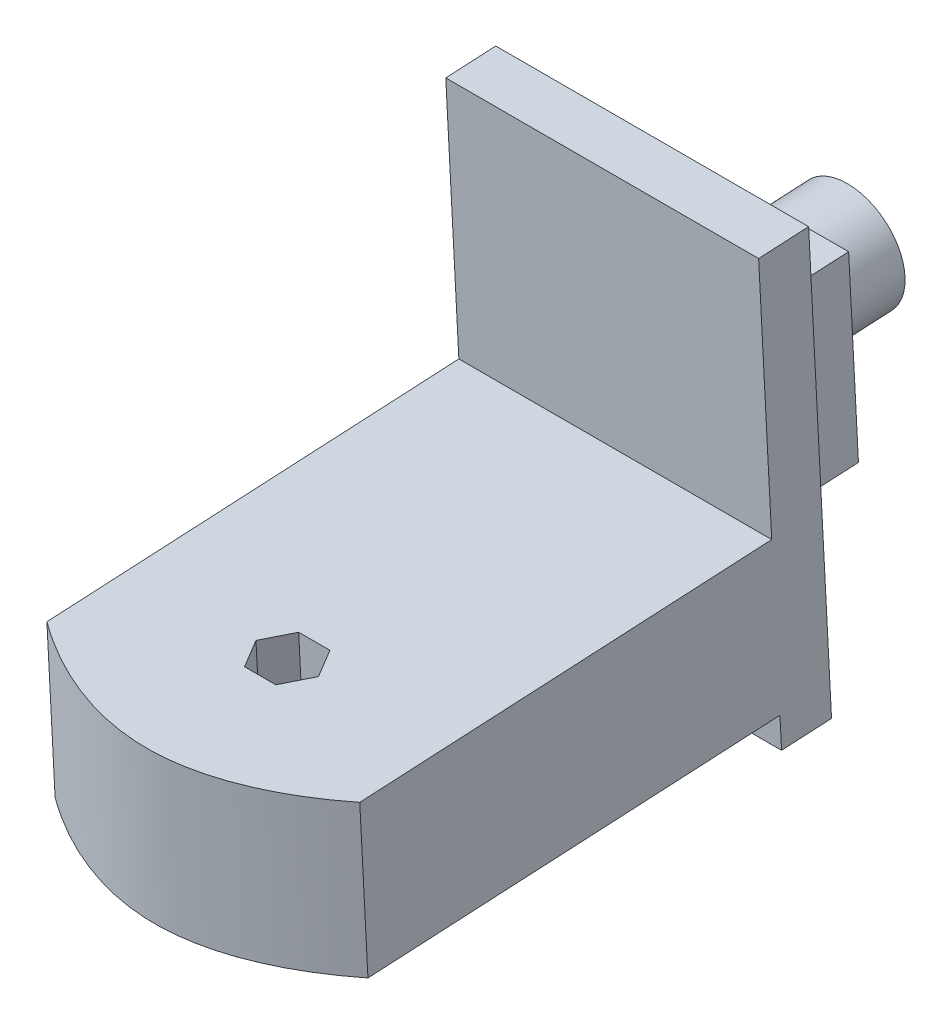
ISO-10303-21;
HEADER;
FILE_DESCRIPTION(('STEP AP214'),'2;1');
FILE_NAME('part.step','',(''),(''),'','','');
FILE_SCHEMA(('AUTOMOTIVE_DESIGN { 1 0 10303 214 1 1 1 1 }'));
ENDSEC;
DATA;
#1=APPLICATION_CONTEXT('core data for automotive mechanical design processes');
#2=APPLICATION_PROTOCOL_DEFINITION('international standard','automotive_design',2000,#1);
#3=PRODUCT_CONTEXT('',#1,'mechanical');
#4=PRODUCT('Part','Part','',(#3));
#5=PRODUCT_RELATED_PRODUCT_CATEGORY('part','',(#4));
#6=PRODUCT_DEFINITION_FORMATION('','',#4);
#7=PRODUCT_DEFINITION_CONTEXT('part definition',#1,'design');
#8=PRODUCT_DEFINITION('design','',#6,#7);
#9=PRODUCT_DEFINITION_SHAPE('','',#8);
#10=(LENGTH_UNIT() NAMED_UNIT(*) SI_UNIT(.MILLI.,.METRE.));
#11=(NAMED_UNIT(*) PLANE_ANGLE_UNIT() SI_UNIT($,.RADIAN.));
#12=(NAMED_UNIT(*) SI_UNIT($,.STERADIAN.) SOLID_ANGLE_UNIT());
#13=UNCERTAINTY_MEASURE_WITH_UNIT(LENGTH_MEASURE(1.E-05),#10,'distance_accuracy_value','');
#14=(GEOMETRIC_REPRESENTATION_CONTEXT(3) GLOBAL_UNCERTAINTY_ASSIGNED_CONTEXT((#13)) GLOBAL_UNIT_ASSIGNED_CONTEXT((#10,
#11,#12)) REPRESENTATION_CONTEXT('',''));
#15=CARTESIAN_POINT('',(0.,0.,0.));
#16=DIRECTION('',(0.,0.,1.));
#17=DIRECTION('',(1.,0.,0.));
#18=AXIS2_PLACEMENT_3D('',#15,#16,#17);
#19=CARTESIAN_POINT('',(170.943026116261,-96.0443024505512,-27.8509531780287));
#20=DIRECTION('',(-2.35658714764497E-13,0.0523359562420088,-0.998629534754623));
#21=DIRECTION('',(0.,0.998629534754623,0.0523359562420088));
#22=AXIS2_PLACEMENT_3D('',#19,#20,#21);
#23=PLANE('',#22);
#24=DIRECTION('',(-1.,0.,2.35355942975305E-13));
#25=VECTOR('',#24,1.);
#26=CARTESIAN_POINT('',(-5.36812434298047E-12,-14.6244424314603,-23.5839191249282));
#27=LINE('',#26,#25);
#28=CARTESIAN_POINT('',(369.809169947691,-14.6244424314557,-23.5839191250153));
#29=VERTEX_POINT('',#28);
#30=CARTESIAN_POINT('',(359.809169947688,-14.6244424314558,-23.5839191250129));
#31=VERTEX_POINT('',#30);
#32=EDGE_CURVE('E220',#29,#31,#27,.T.);
#33=ORIENTED_EDGE('',*,*,#32,.T.);
#34=DIRECTION('',(0.,-0.998629534754623,-0.0523359562420088));
#35=VECTOR('',#34,1.);
#36=CARTESIAN_POINT('',(359.809169947689,1.19253829905249,-22.7549862899792));
#37=LINE('',#36,#35);
#38=CARTESIAN_POINT('',(359.809169947689,-22.6134787094928,-24.002606774949));
#39=VERTEX_POINT('',#38);
#40=EDGE_CURVE('E226',#31,#39,#37,.T.);
#41=ORIENTED_EDGE('',*,*,#40,.T.);
#42=DIRECTION('',(1.,0.,-2.35335752686142E-13));
#43=VECTOR('',#42,1.);
#44=CARTESIAN_POINT('',(170.943026116261,-22.6134787094951,-24.0026067749045));
#45=LINE('',#44,#43);
#46=CARTESIAN_POINT('',(369.80916994769,-22.6134787094927,-24.0026067749513));
#47=VERTEX_POINT('',#46);
#48=EDGE_CURVE('E275',#47,#39,#45,.F.);
#49=ORIENTED_EDGE('',*,*,#48,.F.);
#50=DIRECTION('',(0.,-0.998629534754623,-0.0523359562420088));
#51=VECTOR('',#50,1.);
#52=CARTESIAN_POINT('',(369.80916994769,1.19253829905262,-22.7549862899815));
#53=LINE('',#52,#51);
#54=EDGE_CURVE('E239',#29,#47,#53,.T.);
#55=ORIENTED_EDGE('',*,*,#54,.F.);
#56=EDGE_LOOP('',(#33,#41,#49,#55));
#57=FACE_BOUND('',#56,.T.);
#58=ADVANCED_FACE('F53',(#57),#23,.F.);
#59=DIRECTION('',(1.,0.,-2.35335752686142E-13));
#60=VECTOR('',#59,1.);
#61=CARTESIAN_POINT('',(170.943026116261,-27.6066263832683,-24.2642865561146));
#62=LINE('',#61,#60);
#63=CARTESIAN_POINT('',(359.809169947689,-27.6066263832659,-24.264286556159));
#64=VERTEX_POINT('',#63);
#65=CARTESIAN_POINT('',(369.80916994769,-27.6066263832658,-24.2642865561614));
#66=VERTEX_POINT('',#65);
#67=EDGE_CURVE('E430',#64,#66,#62,.T.);
#68=ORIENTED_EDGE('',*,*,#67,.F.);
#69=CARTESIAN_POINT('',(359.809169947688,-28.6052559180206,-24.316622512401));
#70=VERTEX_POINT('',#69);
#71=EDGE_CURVE('E185',#64,#70,#37,.T.);
#72=ORIENTED_EDGE('',*,*,#71,.T.);
#73=DIRECTION('',(-1.,0.,2.35354992675635E-13));
#74=VECTOR('',#73,1.);
#75=CARTESIAN_POINT('',(-5.36556898368748E-12,-28.6052559180251,-24.3166225123164));
#76=LINE('',#75,#74);
#77=CARTESIAN_POINT('',(369.80916994769,-28.6052559180204,-24.3166225124034));
#78=VERTEX_POINT('',#77);
#79=EDGE_CURVE('E231',#78,#70,#76,.T.);
#80=ORIENTED_EDGE('',*,*,#79,.F.);
#81=EDGE_CURVE('E243',#66,#78,#53,.T.);
#82=ORIENTED_EDGE('',*,*,#81,.F.);
#83=EDGE_LOOP('',(#68,#72,#80,#82));
#84=FACE_BOUND('',#83,.T.);
#85=ADVANCED_FACE('F55',(#84),#23,.F.);
#86=CARTESIAN_POINT('',(369.80916994769,-26.3944066573955,-9.18017162245737));
#87=DIRECTION('',(1.,0.,0.));
#88=DIRECTION('',(0.,0.,-1.));
#89=AXIS2_PLACEMENT_3D('',#86,#87,#88);
#90=PLANE('',#89);
#91=DIRECTION('',(0.,-0.998629534754574,-0.0523359562429485));
#92=VECTOR('',#91,1.);
#93=CARTESIAN_POINT('',(369.80916994769,-23.3035608042251,-10.8350559996082));
#94=LINE('',#93,#92);
#95=CARTESIAN_POINT('',(369.80916994769,-23.3035608042251,-10.8350559996082));
#96=VERTEX_POINT('',#95);
#97=CARTESIAN_POINT('',(369.80916994769,-28.296708477998,-11.0967357808229));
#98=VERTEX_POINT('',#97);
#99=EDGE_CURVE('E324',#96,#98,#94,.T.);
#100=ORIENTED_EDGE('',*,*,#99,.T.);
#101=DIRECTION('',(0.,0.0523359562429438,-0.998629534754574));
#102=VECTOR('',#101,1.);
#103=CARTESIAN_POINT('',(369.80916994769,-28.3916657269047,-9.28484353494327));
#104=LINE('',#103,#102);
#105=EDGE_CURVE('E325',#66,#98,#104,.F.);
#106=ORIENTED_EDGE('',*,*,#105,.F.);
#107=ORIENTED_EDGE('',*,*,#81,.T.);
#108=DIRECTION('',(2.35658714764497E-13,-0.0523359562420088,0.998629534754623));
#109=VECTOR('',#108,1.);
#110=CARTESIAN_POINT('',(369.809169947688,-28.3396541651841,-29.3846058628639));
#111=LINE('',#110,#109);
#112=CARTESIAN_POINT('',(369.809169947689,-28.5215183880332,-25.9144297680107));
#113=VERTEX_POINT('',#112);
#114=EDGE_CURVE('E233',#113,#78,#111,.T.);
#115=ORIENTED_EDGE('',*,*,#114,.F.);
#116=DIRECTION('',(0.,0.998629534754623,0.0523359562420088));
#117=VECTOR('',#116,1.);
#118=CARTESIAN_POINT('',(369.809169947689,-95.9605649205602,-29.4487604336828));
#119=LINE('',#118,#117);
#120=CARTESIAN_POINT('',(369.809169947691,-14.5407049014684,-25.1817263806226));
#121=VERTEX_POINT('',#120);
#122=EDGE_CURVE('E237',#113,#121,#119,.T.);
#123=ORIENTED_EDGE('',*,*,#122,.T.);
#124=DIRECTION('',(2.35658714764497E-13,-0.0523359562420088,0.998629534754623));
#125=VECTOR('',#124,1.);
#126=CARTESIAN_POINT('',(369.80916994769,-14.3588406786194,-28.6519024754758));
#127=LINE('',#126,#125);
#128=EDGE_CURVE('E230',#121,#29,#127,.T.);
#129=ORIENTED_EDGE('',*,*,#128,.T.);
#130=ORIENTED_EDGE('',*,*,#54,.T.);
#131=DIRECTION('',(0.,0.0523359562429438,-0.998629534754574));
#132=VECTOR('',#131,1.);
#133=CARTESIAN_POINT('',(369.80916994769,-23.3985180531318,-9.02316375372855));
#134=LINE('',#133,#132);
#135=EDGE_CURVE('E281',#47,#96,#134,.F.);
#136=ORIENTED_EDGE('',*,*,#135,.T.);
#137=EDGE_LOOP('',(#100,#106,#107,#115,#123,#129,#130,#136));
#138=FACE_BOUND('',#137,.T.);
#139=ADVANCED_FACE('F421',(#138),#90,.T.);
#140=CARTESIAN_POINT('',(369.80916994769,-18.3179028519629,-10.5737687380653));
#141=CARTESIAN_POINT('',(368.37085052264,-18.3725343942236,-9.53133681272721));
#142=CARTESIAN_POINT('',(366.628871560234,-18.4126554324053,-8.76578179912894));
#143=CARTESIAN_POINT('',(363.019201443494,-18.4130630903801,-8.75800322158937));
#144=CARTESIAN_POINT('',(361.259076626337,-18.3729745117132,-9.52293887074917));
#145=CARTESIAN_POINT('',(359.809169947689,-18.3179028519629,-10.5737687380653));
#146=CARTESIAN_POINT('',(369.80916994769,-19.5836657872643,-10.6401045626032));
#147=CARTESIAN_POINT('',(368.37085052264,-19.638297329525,-9.59767263726513));
#148=CARTESIAN_POINT('',(366.628871560234,-19.6784183677067,-8.83211762366687));
#149=CARTESIAN_POINT('',(363.019201443494,-19.6788260256816,-8.8243390461273));
#150=CARTESIAN_POINT('',(361.259076626337,-19.6387374470147,-9.58927469528711));
#151=CARTESIAN_POINT('',(359.809169947689,-19.5836657872643,-10.6401045626032));
#152=CARTESIAN_POINT('',(369.80916994769,-20.55732958365,-10.6911321199401));
#153=CARTESIAN_POINT('',(368.37085052264,-20.6119611259108,-9.64870019460201));
#154=CARTESIAN_POINT('',(366.628871560234,-20.6520821640924,-8.88314518100374));
#155=CARTESIAN_POINT('',(363.019201443494,-20.6524898220672,-8.87536660346417));
#156=CARTESIAN_POINT('',(361.259076626337,-20.6124012434004,-9.64030225262397));
#157=CARTESIAN_POINT('',(359.809169947689,-20.55732958365,-10.6911321199401));
#158=CARTESIAN_POINT('',(369.80916994769,-21.306301734716,-10.7303840871223));
#159=CARTESIAN_POINT('',(368.37085052264,-21.3609332769766,-9.68795216178423));
#160=CARTESIAN_POINT('',(366.628871560234,-21.4010543151584,-8.92239714818595));
#161=CARTESIAN_POINT('',(363.019201443494,-21.4014619731332,-8.91461857064637));
#162=CARTESIAN_POINT('',(361.259076626337,-21.3613733944663,-9.67955421980619));
#163=CARTESIAN_POINT('',(359.809169947689,-21.306301734716,-10.7303840871223));
#164=CARTESIAN_POINT('',(369.80916994769,-26.2994494084888,-10.992063868337));
#165=CARTESIAN_POINT('',(368.37085052264,-26.3540809507496,-9.94963194299893));
#166=CARTESIAN_POINT('',(366.628871560234,-26.3942019889312,-9.18407692940067));
#167=CARTESIAN_POINT('',(363.019201443494,-26.394609646906,-9.17629835186109));
#168=CARTESIAN_POINT('',(361.259076626337,-26.3545210682391,-9.94123400102091));
#169=CARTESIAN_POINT('',(359.809169947689,-26.2994494084888,-10.992063868337));
#170=CARTESIAN_POINT('',(369.80916994769,-27.2980789432434,-11.0443998245799));
#171=CARTESIAN_POINT('',(368.37085052264,-27.3527104855041,-10.0019678992419));
#172=CARTESIAN_POINT('',(366.628871560234,-27.3928315236858,-9.23641288564361));
#173=CARTESIAN_POINT('',(363.019201443494,-27.3932391816606,-9.22863430810403));
#174=CARTESIAN_POINT('',(361.259076626337,-27.3531506029937,-9.99356995726385));
#175=CARTESIAN_POINT('',(359.809169947689,-27.2980789432434,-11.0443998245799));
#176=CARTESIAN_POINT('',(369.80916994769,-28.0220853559405,-11.0823433928561));
#177=CARTESIAN_POINT('',(368.37085052264,-28.0767168982012,-10.039911467518));
#178=CARTESIAN_POINT('',(366.628871560234,-28.1168379363829,-9.27435645391975));
#179=CARTESIAN_POINT('',(363.019201443494,-28.1172455943577,-9.26657787638017));
#180=CARTESIAN_POINT('',(361.259076626337,-28.0771570156908,-10.03151352554));
#181=CARTESIAN_POINT('',(359.809169947689,-28.0220853559405,-11.0823433928561));
#182=CARTESIAN_POINT('',(369.80916994769,-28.2967084779979,-11.0967357808229));
#183=CARTESIAN_POINT('',(368.37085052264,-28.3513400202587,-10.0543038554848));
#184=CARTESIAN_POINT('',(366.628871560234,-28.3914610584403,-9.28874884188655));
#185=CARTESIAN_POINT('',(363.019201443494,-28.3918687164152,-9.28097026434697));
#186=CARTESIAN_POINT('',(361.259076626337,-28.3517801377483,-10.0459059135068));
#187=CARTESIAN_POINT('',(359.809169947689,-28.2967084779979,-11.0967357808229));
#188=CARTESIAN_POINT('',(369.80916994769,-29.2878482912419,-11.148679217394));
#189=CARTESIAN_POINT('',(368.37085052264,-29.3424798335026,-10.1062472920559));
#190=CARTESIAN_POINT('',(366.628871560234,-29.3826008716842,-9.34069227845767));
#191=CARTESIAN_POINT('',(363.019201443494,-29.3830085296591,-9.33291370091809));
#192=CARTESIAN_POINT('',(361.259076626337,-29.3429199509922,-10.0978493500779));
#193=CARTESIAN_POINT('',(359.809169947689,-29.2878482912419,-11.148679217394));
#194=B_SPLINE_SURFACE_WITH_KNOTS('',1,3,((#140,#141,#142,#143,#144,#145),(#146,#147,#148,#149,
#150,#151),(#152,#153,#154,#155,#156,#157),(#158,#159,#160,#161,#162,#163),(#164,#165,#166,#167,
#168,#169),(#170,#171,#172,#173,#174,#175),(#176,#177,#178,#179,#180,#181),(#182,#183,#184,#185,
#186,#187),(#188,#189,#190,#191,#192,#193)),.UNSPECIFIED.,.F.,.F.,.F.,(2,1,1,1,1,1,1,1,2),(4,2,
4),(-0.5985,-0.345,-0.15,0.,1.,1.2,1.345,1.4,1.5985),(0.,0.00535800247808712,
0.0107160049561742),.UNSPECIFIED.);
#195=CARTESIAN_POINT('',(369.80916994769,-23.3035608042251,-10.8350559996082));
#196=CARTESIAN_POINT('',(369.646763180283,-23.309727978548,-10.7173793033761));
#197=CARTESIAN_POINT('',(369.481339566826,-23.3156806743701,-10.6037951007333));
#198=CARTESIAN_POINT('',(369.144058278917,-23.3271329038055,-10.3852735454972));
#199=CARTESIAN_POINT('',(368.972180433007,-23.3326308084866,-10.2803672747815));
#200=CARTESIAN_POINT('',(368.622499520392,-23.3431125227902,-10.0803642514331));
#201=CARTESIAN_POINT('',(368.444689571786,-23.3480957057507,-9.98527945622294));
#202=CARTESIAN_POINT('',(368.081454844204,-23.3575396683834,-9.80507791435565));
#203=CARTESIAN_POINT('',(367.895965319617,-23.3619936551765,-9.72009078354988));
#204=CARTESIAN_POINT('',(367.519900970822,-23.3702399093267,-9.56274288094822));
#205=CARTESIAN_POINT('',(367.32933170034,-23.3740328677293,-9.49036892321715));
#206=CARTESIAN_POINT('',(366.943547961573,-23.3808857743893,-9.35960767452947));
#207=CARTESIAN_POINT('',(366.748337053214,-23.3839462656723,-9.30121002202756));
#208=CARTESIAN_POINT('',(366.424552069651,-23.3883060878852,-9.21801965844856));
#209=CARTESIAN_POINT('',(366.297137435068,-23.3898436904919,-9.18868045293912));
#210=CARTESIAN_POINT('',(366.040925053869,-23.3925635136076,-9.13678313630305));
#211=CARTESIAN_POINT('',(365.912127374152,-23.3937457512266,-9.11422469869591));
#212=CARTESIAN_POINT('',(365.653486408947,-23.3957335024187,-9.0762961464982));
#213=CARTESIAN_POINT('',(365.523643252223,-23.3965390616833,-9.06092516006202));
#214=CARTESIAN_POINT('',(365.264152309548,-23.3977508250917,-9.03780333683281));
#215=CARTESIAN_POINT('',(365.134509081763,-23.3981596784156,-9.03000195067444));
#216=CARTESIAN_POINT('',(364.874973528932,-23.3985683630251,-9.02220378377817));
#217=CARTESIAN_POINT('',(364.745081190864,-23.3985681723107,-9.02220742282585));
#218=CARTESIAN_POINT('',(364.485554127226,-23.3981563785426,-9.03006491600111));
#219=CARTESIAN_POINT('',(364.355919386245,-23.3977448008905,-9.03791828543818));
#220=CARTESIAN_POINT('',(364.033098571467,-23.3962292759288,-9.0668362243872));
#221=CARTESIAN_POINT('',(363.840315910256,-23.3948830255922,-9.09252421107623));
#222=CARTESIAN_POINT('',(363.457471699658,-23.3913819649661,-9.15932842743316));
#223=CARTESIAN_POINT('',(363.26741057093,-23.3892270310521,-9.20044701600064));
#224=CARTESIAN_POINT('',(362.889720298335,-23.3841654547606,-9.29702764507382));
#225=CARTESIAN_POINT('',(362.702114142896,-23.3812541436457,-9.35257877039789));
#226=CARTESIAN_POINT('',(362.331251064509,-23.374758094915,-9.4765307641582));
#227=CARTESIAN_POINT('',(362.147993865988,-23.3711734000973,-9.54493081595932));
#228=CARTESIAN_POINT('',(361.774454714102,-23.3631421579375,-9.69817604538165));
#229=CARTESIAN_POINT('',(361.584495577115,-23.3586546145801,-9.7838034735765));
#230=CARTESIAN_POINT('',(361.210364396561,-23.3490586828724,-9.96690475813629));
#231=CARTESIAN_POINT('',(361.026193636234,-23.3439501580603,-10.0643812183486));
#232=CARTESIAN_POINT('',(360.666263451868,-23.3332416210558,-10.2687122766587));
#233=CARTESIAN_POINT('',(360.490426804504,-23.3276486920834,-10.3754317188651));
#234=CARTESIAN_POINT('',(360.145054346671,-23.315966345655,-10.5983441678988));
#235=CARTESIAN_POINT('',(359.975514095746,-23.3098772881534,-10.7145303063862));
#236=CARTESIAN_POINT('',(359.809169947689,-23.3035608042251,-10.8350559996082));
#237=B_SPLINE_CURVE_WITH_KNOTS('',3,(#195,#196,#197,#198,#199,#200,#201,#202,#203,#204,#205,
#206,#207,#208,#209,#210,#211,#212,#213,#214,#215,#216,#217,#218,#219,#220,#221,#222,#223,#224,
#225,#226,#227,#228,#229,#230,#231,#232,#233,#234,#235,#236),.UNSPECIFIED.,.F.,.F.,(4,2,2,2,2,2,
2,2,2,2,2,2,2,2,2,2,2,2,2,2,4),(0.,0.601948124640674,1.2059664785925,1.81071175182481,
2.42253123166662,3.03370722186758,3.64442869411318,4.0365418118416,4.4286360470769,
4.82068270851116,5.21009290789558,5.59952405132412,5.98893115037018,6.57167945753763,
7.15451688663984,7.7410410770076,8.3275280024482,8.95231625889374,9.57724206280081,
10.1942138335945,10.810741894198),.UNSPECIFIED.);
#238=CARTESIAN_POINT('',(359.809169947689,-23.3035608042251,-10.8350559996082));
#239=VERTEX_POINT('',#238);
#240=EDGE_CURVE('E274',#96,#239,#237,.T.);
#241=DIRECTION('',(0.,0.998629534754574,0.0523359562429485));
#242=VECTOR('',#241,1.);
#243=CARTESIAN_POINT('',(359.809169947689,-28.2967084779979,-11.0967357808229));
#244=LINE('',#243,#242);
#245=CARTESIAN_POINT('',(359.809169947689,-28.296708477998,-11.0967357808229));
#246=VERTEX_POINT('',#245);
#247=EDGE_CURVE('E270',#246,#239,#244,.T.);
#248=CARTESIAN_POINT('',(369.80916994769,-28.2967084779979,-11.0967357808229));
#249=CARTESIAN_POINT('',(369.646763180283,-28.3028756523209,-10.9790590845908));
#250=CARTESIAN_POINT('',(369.481339566826,-28.308828348143,-10.865474881948));
#251=CARTESIAN_POINT('',(369.144058278917,-28.3202805775784,-10.6469533267119));
#252=CARTESIAN_POINT('',(368.972180433007,-28.3257784822595,-10.5420470559963));
#253=CARTESIAN_POINT('',(368.622499520392,-28.3362601965631,-10.3420440326479));
#254=CARTESIAN_POINT('',(368.444689571786,-28.3412433795236,-10.2469592374377));
#255=CARTESIAN_POINT('',(368.081454844204,-28.3506873421563,-10.0667576955704));
#256=CARTESIAN_POINT('',(367.895965319617,-28.3551413289494,-9.98177056476466));
#257=CARTESIAN_POINT('',(367.519900970823,-28.3633875830996,-9.82442266216302));
#258=CARTESIAN_POINT('',(367.32933170034,-28.3671805415022,-9.75204870443193));
#259=CARTESIAN_POINT('',(366.943547961573,-28.3740334481622,-9.62128745574422));
#260=CARTESIAN_POINT('',(366.748337053214,-28.3770939394452,-9.56288980324229));
#261=CARTESIAN_POINT('',(366.424552069651,-28.3814537616581,-9.47969943966329));
#262=CARTESIAN_POINT('',(366.297137435068,-28.3829913642648,-9.45036023415386));
#263=CARTESIAN_POINT('',(366.040925053869,-28.3857111873805,-9.39846291751778));
#264=CARTESIAN_POINT('',(365.912127374152,-28.3868934249995,-9.37590447991064));
#265=CARTESIAN_POINT('',(365.653486408948,-28.3888811761916,-9.33797592771292));
#266=CARTESIAN_POINT('',(365.523643252223,-28.3896867354562,-9.32260494127673));
#267=CARTESIAN_POINT('',(365.264152309548,-28.3908984988646,-9.29948311804752));
#268=CARTESIAN_POINT('',(365.134509081763,-28.3913073521885,-9.29168173188915));
#269=CARTESIAN_POINT('',(364.874973528932,-28.391716036798,-9.28388356499288));
#270=CARTESIAN_POINT('',(364.745081190864,-28.3917158460836,-9.28388720404057));
#271=CARTESIAN_POINT('',(364.485554127226,-28.3913040523155,-9.29174469721583));
#272=CARTESIAN_POINT('',(364.355919386245,-28.3908924746634,-9.29959806665289));
#273=CARTESIAN_POINT('',(364.033098571467,-28.3893769497016,-9.32851600560191));
#274=CARTESIAN_POINT('',(363.840315910256,-28.388030699365,-9.35420399229096));
#275=CARTESIAN_POINT('',(363.457471699658,-28.384529638739,-9.42100820864789));
#276=CARTESIAN_POINT('',(363.26741057093,-28.382374704825,-9.46212679721535));
#277=CARTESIAN_POINT('',(362.889720298335,-28.3773131285335,-9.55870742628855));
#278=CARTESIAN_POINT('',(362.702114142896,-28.3744018174186,-9.61425855161266));
#279=CARTESIAN_POINT('',(362.331251064509,-28.3679057686879,-9.73821054537299));
#280=CARTESIAN_POINT('',(362.147993865988,-28.3643210738701,-9.80661059717406));
#281=CARTESIAN_POINT('',(361.774454714102,-28.3562898317104,-9.95985582659642));
#282=CARTESIAN_POINT('',(361.584495577115,-28.351802288353,-10.0454832547913));
#283=CARTESIAN_POINT('',(361.210364396561,-28.3422063566453,-10.2285845393511));
#284=CARTESIAN_POINT('',(361.026193636234,-28.3370978318332,-10.3260609995633));
#285=CARTESIAN_POINT('',(360.666263451868,-28.3263892948287,-10.5303920578735));
#286=CARTESIAN_POINT('',(360.490426804504,-28.3207963658563,-10.6371115000798));
#287=CARTESIAN_POINT('',(360.145054346671,-28.3091140194279,-10.8600239491136));
#288=CARTESIAN_POINT('',(359.975514095746,-28.3030249619263,-10.976210087601));
#289=CARTESIAN_POINT('',(359.809169947689,-28.2967084779979,-11.0967357808229));
#290=B_SPLINE_CURVE_WITH_KNOTS('',3,(#248,#249,#250,#251,#252,#253,#254,#255,#256,#257,#258,
#259,#260,#261,#262,#263,#264,#265,#266,#267,#268,#269,#270,#271,#272,#273,#274,#275,#276,#277,
#278,#279,#280,#281,#282,#283,#284,#285,#286,#287,#288,#289),.UNSPECIFIED.,.F.,.F.,(4,2,2,2,2,2,
2,2,2,2,2,2,2,2,2,2,2,2,2,2,4),(0.,0.601948124640672,1.20596647859242,1.81071175182478,
2.4225312316665,3.03370722186742,3.64442869411309,4.03654181184151,4.42863604707686,
4.82068270851117,5.21009290789566,5.59952405132414,5.98893115037025,6.57167945753776,
7.15451688663997,7.74104107700775,8.32752800244833,8.95231625889386,9.57724206280093,
10.1942138335945,10.810741894198),.UNSPECIFIED.);
#291=EDGE_CURVE('E316',#98,#246,#290,.T.);
#292=ORIENTED_EDGE('',*,*,#99,.F.);
#293=ORIENTED_EDGE('',*,*,#240,.T.);
#294=ORIENTED_EDGE('',*,*,#247,.F.);
#295=ORIENTED_EDGE('',*,*,#291,.F.);
#296=EDGE_LOOP('',(#292,#293,#294,#295));
#297=FACE_BOUND('',#296,.T.);
#298=ADVANCED_FACE('F296',(#297),#194,.F.);
#299=CARTESIAN_POINT('',(359.809169947689,-28.3916657269047,-9.28484353494327));
#300=DIRECTION('',(0.,-0.998629534754574,-0.0523359562429438));
#301=DIRECTION('',(0.,0.0523359562429438,-0.998629534754574));
#302=AXIS2_PLACEMENT_3D('',#299,#300,#301);
#303=PLANE('',#302);
#304=DIRECTION('',(1.,0.,0.));
#305=VECTOR('',#304,1.);
#306=CARTESIAN_POINT('',(364.309169947689,-28.1108296561737,-14.6435149874058));
#307=LINE('',#306,#305);
#308=CARTESIAN_POINT('',(364.309169947689,-28.1108296561737,-14.6435149874058));
#309=VERTEX_POINT('',#308);
#310=CARTESIAN_POINT('',(365.30916994769,-28.1108296561737,-14.6435149874057));
#311=VERTEX_POINT('',#310);
#312=EDGE_CURVE('E354',#309,#311,#307,.T.);
#313=ORIENTED_EDGE('',*,*,#312,.F.);
#314=DIRECTION('',(0.499999999999956,0.0453242676377388,-0.864838546066921));
#315=VECTOR('',#314,1.);
#316=CARTESIAN_POINT('',(363.809169947689,-28.1561539238115,-13.7786764413389));
#317=LINE('',#316,#315);
#318=CARTESIAN_POINT('',(363.809169947689,-28.1561539238115,-13.7786764413389));
#319=VERTEX_POINT('',#318);
#320=EDGE_CURVE('E370',#319,#309,#317,.T.);
#321=ORIENTED_EDGE('',*,*,#320,.F.);
#322=DIRECTION('',(-0.500000000000007,0.0453242676377418,-0.864838546066892));
#323=VECTOR('',#322,1.);
#324=CARTESIAN_POINT('',(364.30916994769,-28.2014781914492,-12.913837895272));
#325=LINE('',#324,#323);
#326=CARTESIAN_POINT('',(364.30916994769,-28.2014781914492,-12.913837895272));
#327=VERTEX_POINT('',#326);
#328=EDGE_CURVE('E367',#327,#319,#325,.T.);
#329=ORIENTED_EDGE('',*,*,#328,.F.);
#330=DIRECTION('',(-1.,0.,0.));
#331=VECTOR('',#330,1.);
#332=CARTESIAN_POINT('',(365.30916994769,-28.2014781914492,-12.913837895272));
#333=LINE('',#332,#331);
#334=CARTESIAN_POINT('',(365.30916994769,-28.2014781914492,-12.913837895272));
#335=VERTEX_POINT('',#334);
#336=EDGE_CURVE('E364',#335,#327,#333,.T.);
#337=ORIENTED_EDGE('',*,*,#336,.F.);
#338=DIRECTION('',(-0.50000000000001,-0.0453242676377421,0.86483854606689));
#339=VECTOR('',#338,1.);
#340=CARTESIAN_POINT('',(365.80916994769,-28.1561539238115,-13.7786764413388));
#341=LINE('',#340,#339);
#342=CARTESIAN_POINT('',(365.80916994769,-28.1561539238115,-13.7786764413388));
#343=VERTEX_POINT('',#342);
#344=EDGE_CURVE('E361',#343,#335,#341,.T.);
#345=ORIENTED_EDGE('',*,*,#344,.F.);
#346=DIRECTION('',(0.500000000000008,-0.0453242676377384,0.864838546066891));
#347=VECTOR('',#346,1.);
#348=CARTESIAN_POINT('',(365.30916994769,-28.1108296561737,-14.6435149874057));
#349=LINE('',#348,#347);
#350=EDGE_CURVE('E356',#311,#343,#349,.T.);
#351=ORIENTED_EDGE('',*,*,#350,.F.);
#352=EDGE_LOOP('',(#313,#321,#329,#337,#345,#351));
#353=FACE_BOUND('',#352,.T.);
#354=DIRECTION('',(0.,0.0523359562429438,-0.998629534754574));
#355=VECTOR('',#354,1.);
#356=CARTESIAN_POINT('',(359.809169947689,-28.3916657269047,-9.28484353494327));
#357=LINE('',#356,#355);
#358=EDGE_CURVE('E434',#246,#64,#357,.T.);
#359=ORIENTED_EDGE('',*,*,#358,.T.);
#360=ORIENTED_EDGE('',*,*,#67,.T.);
#361=ORIENTED_EDGE('',*,*,#105,.T.);
#362=ORIENTED_EDGE('',*,*,#291,.T.);
#363=EDGE_LOOP('',(#359,#360,#361,#362));
#364=FACE_BOUND('',#363,.T.);
#365=ADVANCED_FACE('F311',(#353,#364),#303,.T.);
#366=CARTESIAN_POINT('',(359.809169947689,-26.3944066573955,-9.18017162245739));
#367=DIRECTION('',(-1.,0.,0.));
#368=DIRECTION('',(0.,0.,1.));
#369=AXIS2_PLACEMENT_3D('',#366,#367,#368);
#370=PLANE('',#369);
#371=DIRECTION('',(0.,0.052335956242944,-0.998629534754574));
#372=VECTOR('',#371,1.);
#373=CARTESIAN_POINT('',(359.809169947689,-23.3035608042251,-10.8350559996082));
#374=LINE('',#373,#372);
#375=EDGE_CURVE('E268',#239,#39,#374,.T.);
#376=ORIENTED_EDGE('',*,*,#375,.T.);
#377=ORIENTED_EDGE('',*,*,#40,.F.);
#378=DIRECTION('',(2.35658714764497E-13,-0.0523359562420088,0.998629534754623));
#379=VECTOR('',#378,1.);
#380=CARTESIAN_POINT('',(359.809169947687,-14.3588406786195,-28.6519024754735));
#381=LINE('',#380,#379);
#382=CARTESIAN_POINT('',(359.809169947688,-14.5407049014685,-25.1817263806214));
#383=VERTEX_POINT('',#382);
#384=EDGE_CURVE('E228',#383,#31,#381,.T.);
#385=ORIENTED_EDGE('',*,*,#384,.F.);
#386=DIRECTION('',(0.,0.998629534754623,0.0523359562420088));
#387=VECTOR('',#386,1.);
#388=CARTESIAN_POINT('',(359.809169947689,-95.9605649205603,-29.4487604336805));
#389=LINE('',#388,#387);
#390=CARTESIAN_POINT('',(359.809169947688,-28.5215183880333,-25.9144297680096));
#391=VERTEX_POINT('',#390);
#392=EDGE_CURVE('E352',#391,#383,#389,.T.);
#393=ORIENTED_EDGE('',*,*,#392,.F.);
#394=DIRECTION('',(2.35658714764497E-13,-0.0523359562420088,0.998629534754623));
#395=VECTOR('',#394,1.);
#396=CARTESIAN_POINT('',(359.809169947687,-28.3396541651843,-29.3846058628616));
#397=LINE('',#396,#395);
#398=EDGE_CURVE('E235',#391,#70,#397,.T.);
#399=ORIENTED_EDGE('',*,*,#398,.T.);
#400=ORIENTED_EDGE('',*,*,#71,.F.);
#401=ORIENTED_EDGE('',*,*,#358,.F.);
#402=ORIENTED_EDGE('',*,*,#247,.T.);
#403=EDGE_LOOP('',(#376,#377,#385,#393,#399,#400,#401,#402));
#404=FACE_BOUND('',#403,.T.);
#405=ADVANCED_FACE('F266',(#404),#370,.T.);
#406=CARTESIAN_POINT('',(359.809169947689,-23.3985180531318,-9.02316375372855));
#407=DIRECTION('',(0.,-0.998629534754574,-0.0523359562429438));
#408=DIRECTION('',(0.,0.0523359562429438,-0.998629534754574));
#409=AXIS2_PLACEMENT_3D('',#406,#407,#408);
#410=PLANE('',#409);
#411=DIRECTION('',(0.499999999999956,0.0453242676377414,-0.864838546066921));
#412=VECTOR('',#411,1.);
#413=CARTESIAN_POINT('',(360.860612789175,-23.430288637634,-8.41694488819353));
#414=LINE('',#413,#412);
#415=CARTESIAN_POINT('',(363.809169947689,-23.1630062500386,-13.5169966601241));
#416=VERTEX_POINT('',#415);
#417=CARTESIAN_POINT('',(364.309169947689,-23.1176819824008,-14.381835206191));
#418=VERTEX_POINT('',#417);
#419=EDGE_CURVE('E343',#416,#418,#414,.T.);
#420=ORIENTED_EDGE('',*,*,#419,.T.);
#421=DIRECTION('',(1.,0.,0.));
#422=VECTOR('',#421,1.);
#423=CARTESIAN_POINT('',(359.80916994769,-23.1176819824008,-14.3818352061912));
#424=LINE('',#423,#422);
#425=CARTESIAN_POINT('',(365.30916994769,-23.1176819824008,-14.381835206191));
#426=VERTEX_POINT('',#425);
#427=EDGE_CURVE('E346',#418,#426,#424,.T.);
#428=ORIENTED_EDGE('',*,*,#427,.T.);
#429=DIRECTION('',(0.500000000000008,-0.0453242676377399,0.864838546066891));
#430=VECTOR('',#429,1.);
#431=CARTESIAN_POINT('',(366.257727106204,-23.2036672994453,-12.7411376185282));
#432=LINE('',#431,#430);
#433=CARTESIAN_POINT('',(365.80916994769,-23.1630062500386,-13.5169966601242));
#434=VERTEX_POINT('',#433);
#435=EDGE_CURVE('E331',#426,#434,#432,.T.);
#436=ORIENTED_EDGE('',*,*,#435,.T.);
#437=DIRECTION('',(-0.50000000000001,-0.0453242676377398,0.86483854606689));
#438=VECTOR('',#437,1.);
#439=CARTESIAN_POINT('',(362.360612789174,-23.4756129052717,-7.55210634212674));
#440=LINE('',#439,#438);
#441=CARTESIAN_POINT('',(365.30916994769,-23.2083305176763,-12.6521581140573));
#442=VERTEX_POINT('',#441);
#443=EDGE_CURVE('E334',#434,#442,#440,.T.);
#444=ORIENTED_EDGE('',*,*,#443,.T.);
#445=DIRECTION('',(-1.,0.,0.));
#446=VECTOR('',#445,1.);
#447=CARTESIAN_POINT('',(359.809169947689,-23.2083305176763,-12.6521581140572));
#448=LINE('',#447,#446);
#449=CARTESIAN_POINT('',(364.30916994769,-23.2083305176763,-12.6521581140573));
#450=VERTEX_POINT('',#449);
#451=EDGE_CURVE('E337',#442,#450,#448,.T.);
#452=ORIENTED_EDGE('',*,*,#451,.T.);
#453=DIRECTION('',(-0.500000000000007,0.0453242676377399,-0.864838546066892));
#454=VECTOR('',#453,1.);
#455=CARTESIAN_POINT('',(364.757727106204,-23.248991567083,-11.8762990724613));
#456=LINE('',#455,#454);
#457=EDGE_CURVE('E340',#450,#416,#456,.T.);
#458=ORIENTED_EDGE('',*,*,#457,.T.);
#459=EDGE_LOOP('',(#420,#428,#436,#444,#452,#458));
#460=FACE_BOUND('',#459,.T.);
#461=ORIENTED_EDGE('',*,*,#48,.T.);
#462=ORIENTED_EDGE('',*,*,#375,.F.);
#463=ORIENTED_EDGE('',*,*,#240,.F.);
#464=ORIENTED_EDGE('',*,*,#135,.F.);
#465=EDGE_LOOP('',(#461,#462,#463,#464));
#466=FACE_BOUND('',#465,.T.);
#467=ADVANCED_FACE('F302',(#460,#466),#410,.F.);
#468=CARTESIAN_POINT('',(364.309169947689,-8.77010257612766,-13.6299104314212));
#469=DIRECTION('',(0.,0.0523359562429438,-0.998629534754574));
#470=DIRECTION('',(0.,0.998629534754574,0.0523359562429438));
#471=AXIS2_PLACEMENT_3D('',#468,#469,#470);
#472=PLANE('',#471);
#473=DIRECTION('',(0.,-0.998629534754574,-0.0523359562429438));
#474=VECTOR('',#473,1.);
#475=CARTESIAN_POINT('',(364.309169947689,-8.77010257612766,-13.6299104314212));
#476=LINE('',#475,#474);
#477=EDGE_CURVE('E283',#418,#309,#476,.T.);
#478=ORIENTED_EDGE('',*,*,#477,.T.);
#479=ORIENTED_EDGE('',*,*,#312,.T.);
#480=DIRECTION('',(0.,-0.998629534754574,-0.0523359562429438));
#481=VECTOR('',#480,1.);
#482=CARTESIAN_POINT('',(365.30916994769,-8.77010257612766,-13.6299104314211));
#483=LINE('',#482,#481);
#484=EDGE_CURVE('E373',#426,#311,#483,.T.);
#485=ORIENTED_EDGE('',*,*,#484,.F.);
#486=ORIENTED_EDGE('',*,*,#427,.F.);
#487=EDGE_LOOP('',(#478,#479,#485,#486));
#488=FACE_BOUND('',#487,.T.);
#489=ADVANCED_FACE('F307',(#488),#472,.F.);
#490=CARTESIAN_POINT('',(363.809169947689,-8.8154268437654,-12.7650718853543));
#491=DIRECTION('',(-0.866025403784464,0.0261679781214696,-0.499314767377243));
#492=DIRECTION('',(-0.499485811384465,0.,0.866322067262287));
#493=AXIS2_PLACEMENT_3D('',#490,#491,#492);
#494=PLANE('',#493);
#495=DIRECTION('',(0.,-0.998629534754574,-0.0523359562429438));
#496=VECTOR('',#495,1.);
#497=CARTESIAN_POINT('',(363.809169947689,-8.8154268437654,-12.7650718853543));
#498=LINE('',#497,#496);
#499=EDGE_CURVE('E375',#416,#319,#498,.T.);
#500=ORIENTED_EDGE('',*,*,#499,.T.);
#501=ORIENTED_EDGE('',*,*,#320,.T.);
#502=ORIENTED_EDGE('',*,*,#477,.F.);
#503=ORIENTED_EDGE('',*,*,#419,.F.);
#504=EDGE_LOOP('',(#500,#501,#502,#503));
#505=FACE_BOUND('',#504,.T.);
#506=ADVANCED_FACE('F401',(#505),#494,.F.);
#507=CARTESIAN_POINT('',(364.30916994769,-8.86075111140314,-11.9002333392874));
#508=DIRECTION('',(-0.866025403784435,-0.0261679781214723,0.499314767377294));
#509=DIRECTION('',(0.499485811384515,0.,0.866322067262258));
#510=AXIS2_PLACEMENT_3D('',#507,#508,#509);
#511=PLANE('',#510);
#512=DIRECTION('',(0.,-0.998629534754574,-0.0523359562429438));
#513=VECTOR('',#512,1.);
#514=CARTESIAN_POINT('',(364.30916994769,-8.86075111140314,-11.9002333392874));
#515=LINE('',#514,#513);
#516=EDGE_CURVE('E377',#450,#327,#515,.T.);
#517=ORIENTED_EDGE('',*,*,#516,.T.);
#518=ORIENTED_EDGE('',*,*,#328,.T.);
#519=ORIENTED_EDGE('',*,*,#499,.F.);
#520=ORIENTED_EDGE('',*,*,#457,.F.);
#521=EDGE_LOOP('',(#517,#518,#519,#520));
#522=FACE_BOUND('',#521,.T.);
#523=ADVANCED_FACE('F404',(#522),#511,.F.);
#524=CARTESIAN_POINT('',(365.30916994769,-8.86075111140314,-11.9002333392874));
#525=DIRECTION('',(0.,-0.0523359562429438,0.998629534754574));
#526=DIRECTION('',(0.,-0.998629534754574,-0.0523359562429438));
#527=AXIS2_PLACEMENT_3D('',#524,#525,#526);
#528=PLANE('',#527);
#529=DIRECTION('',(0.,-0.998629534754574,-0.0523359562429438));
#530=VECTOR('',#529,1.);
#531=CARTESIAN_POINT('',(365.30916994769,-8.86075111140314,-11.9002333392874));
#532=LINE('',#531,#530);
#533=EDGE_CURVE('E379',#442,#335,#532,.T.);
#534=ORIENTED_EDGE('',*,*,#533,.T.);
#535=ORIENTED_EDGE('',*,*,#336,.T.);
#536=ORIENTED_EDGE('',*,*,#516,.F.);
#537=ORIENTED_EDGE('',*,*,#451,.F.);
#538=EDGE_LOOP('',(#534,#535,#536,#537));
#539=FACE_BOUND('',#538,.T.);
#540=ADVANCED_FACE('F407',(#539),#528,.F.);
#541=CARTESIAN_POINT('',(365.80916994769,-8.8154268437654,-12.7650718853543));
#542=DIRECTION('',(0.866025403784433,-0.0261679781214724,0.499314767377297));
#543=DIRECTION('',(0.499485811384518,0.,-0.866322067262256));
#544=AXIS2_PLACEMENT_3D('',#541,#542,#543);
#545=PLANE('',#544);
#546=DIRECTION('',(0.,-0.998629534754574,-0.0523359562429438));
#547=VECTOR('',#546,1.);
#548=CARTESIAN_POINT('',(365.80916994769,-8.8154268437654,-12.7650718853543));
#549=LINE('',#548,#547);
#550=EDGE_CURVE('E381',#434,#343,#549,.T.);
#551=ORIENTED_EDGE('',*,*,#550,.T.);
#552=ORIENTED_EDGE('',*,*,#344,.T.);
#553=ORIENTED_EDGE('',*,*,#533,.F.);
#554=ORIENTED_EDGE('',*,*,#443,.F.);
#555=EDGE_LOOP('',(#551,#552,#553,#554));
#556=FACE_BOUND('',#555,.T.);
#557=ADVANCED_FACE('F397',(#556),#545,.F.);
#558=CARTESIAN_POINT('',(365.30916994769,-8.77010257612766,-13.6299104314211));
#559=DIRECTION('',(0.866025403784434,0.0261679781214723,-0.499314767377295));
#560=DIRECTION('',(-0.499485811384516,0.,-0.866322067262257));
#561=AXIS2_PLACEMENT_3D('',#558,#559,#560);
#562=PLANE('',#561);
#563=ORIENTED_EDGE('',*,*,#484,.T.);
#564=ORIENTED_EDGE('',*,*,#350,.T.);
#565=ORIENTED_EDGE('',*,*,#550,.F.);
#566=ORIENTED_EDGE('',*,*,#435,.F.);
#567=EDGE_LOOP('',(#563,#564,#565,#566));
#568=FACE_BOUND('',#567,.T.);
#569=ADVANCED_FACE('F387',(#568),#562,.F.);
#570=CARTESIAN_POINT('',(-6.56152243915069E-12,-28.3396541651888,-29.3846058627769));
#571=DIRECTION('',(0.,0.998629534754623,0.0523359562420088));
#572=DIRECTION('',(0.,-0.0523359562420088,0.998629534754623));
#573=AXIS2_PLACEMENT_3D('',#570,#571,#572);
#574=PLANE('',#573);
#575=DIRECTION('',(1.,0.,-2.35327275138071E-13));
#576=VECTOR('',#575,1.);
#577=CARTESIAN_POINT('',(170.943026116261,-28.5215183880357,-25.914429767964));
#578=LINE('',#577,#576);
#579=EDGE_CURVE('E13',#391,#113,#578,.T.);
#580=ORIENTED_EDGE('',*,*,#579,.T.);
#581=ORIENTED_EDGE('',*,*,#114,.T.);
#582=ORIENTED_EDGE('',*,*,#79,.T.);
#583=ORIENTED_EDGE('',*,*,#398,.F.);
#584=EDGE_LOOP('',(#580,#581,#582,#583));
#585=FACE_BOUND('',#584,.T.);
#586=ADVANCED_FACE('F509',(#585),#574,.F.);
#587=CARTESIAN_POINT('',(-6.56407779844368E-12,-14.358840678624,-28.6519024753888));
#588=DIRECTION('',(0.,0.998629534754623,0.0523359562420088));
#589=DIRECTION('',(0.,-0.0523359562420088,0.998629534754623));
#590=AXIS2_PLACEMENT_3D('',#587,#588,#589);
#591=PLANE('',#590);
#592=ORIENTED_EDGE('',*,*,#384,.T.);
#593=ORIENTED_EDGE('',*,*,#32,.F.);
#594=ORIENTED_EDGE('',*,*,#128,.F.);
#595=DIRECTION('',(1.,0.,-2.35328225437742E-13));
#596=VECTOR('',#595,1.);
#597=CARTESIAN_POINT('',(170.943026116261,-14.5407049014709,-25.1817263805758));
#598=LINE('',#597,#596);
#599=EDGE_CURVE('E62',#383,#121,#598,.T.);
#600=ORIENTED_EDGE('',*,*,#599,.F.);
#601=EDGE_LOOP('',(#592,#593,#594,#600));
#602=FACE_BOUND('',#601,.T.);
#603=ADVANCED_FACE('F259',(#602),#591,.T.);
#604=CARTESIAN_POINT('',(170.943026116261,-95.9605649205626,-29.4487604336361));
#605=DIRECTION('',(-2.35658714764497E-13,0.0523359562420088,-0.998629534754623));
#606=DIRECTION('',(0.,0.998629534754623,0.0523359562420088));
#607=AXIS2_PLACEMENT_3D('',#604,#605,#606);
#608=PLANE('',#607);
#609=DIRECTION('',(0.,0.998629534754623,0.0523359562420087));
#610=VECTOR('',#609,1.);
#611=CARTESIAN_POINT('',(367.809169947689,1.2762758290398,-24.3527935455884));
#612=LINE('',#611,#610);
#613=CARTESIAN_POINT('',(367.809169947689,-24.0276854816374,-25.6789179649212));
#614=VERTEX_POINT('',#613);
#615=CARTESIAN_POINT('',(367.809169947689,-18.0359082731096,-25.3649022274692));
#616=VERTEX_POINT('',#615);
#617=EDGE_CURVE('E183',#614,#616,#612,.T.);
#618=ORIENTED_EDGE('',*,*,#617,.T.);
#619=DIRECTION('',(-1.,0.,2.3528085645073E-13));
#620=VECTOR('',#619,1.);
#621=CARTESIAN_POINT('',(-5.73849544884362E-12,-18.0359082731143,-25.3649022273827));
#622=LINE('',#621,#620);
#623=CARTESIAN_POINT('',(361.809169947688,-18.0359082731097,-25.3649022274678));
#624=VERTEX_POINT('',#623);
#625=EDGE_CURVE('E199',#616,#624,#622,.T.);
#626=ORIENTED_EDGE('',*,*,#625,.T.);
#627=DIRECTION('',(0.,0.998629534754623,0.0523359562420087));
#628=VECTOR('',#627,1.);
#629=CARTESIAN_POINT('',(361.809169947689,1.27627582903973,-24.352793545587));
#630=LINE('',#629,#628);
#631=CARTESIAN_POINT('',(361.809169947689,-24.0276854816374,-25.6789179649198));
#632=VERTEX_POINT('',#631);
#633=EDGE_CURVE('E74',#632,#624,#630,.T.);
#634=ORIENTED_EDGE('',*,*,#633,.F.);
#635=DIRECTION('',(-1.,0.,2.3528085645073E-13));
#636=VECTOR('',#635,1.);
#637=CARTESIAN_POINT('',(-5.73617398785454E-12,-24.027685481642,-25.6789179648347));
#638=LINE('',#637,#636);
#639=EDGE_CURVE('E69',#614,#632,#638,.T.);
#640=ORIENTED_EDGE('',*,*,#639,.F.);
#641=EDGE_LOOP('',(#618,#626,#634,#640));
#642=FACE_BOUND('',#641,.T.);
#643=ORIENTED_EDGE('',*,*,#579,.F.);
#644=ORIENTED_EDGE('',*,*,#392,.T.);
#645=ORIENTED_EDGE('',*,*,#599,.T.);
#646=ORIENTED_EDGE('',*,*,#122,.F.);
#647=EDGE_LOOP('',(#643,#644,#645,#646));
#648=FACE_BOUND('',#647,.T.);
#649=ADVANCED_FACE('F351',(#642,#648),#608,.T.);
#650=CARTESIAN_POINT('',(367.809169947688,1.43851729339003,-27.4485451033277));
#651=DIRECTION('',(1.,0.,-2.35335752686142E-13));
#652=DIRECTION('',(-2.35335752686142E-13,0.,-1.));
#653=AXIS2_PLACEMENT_3D('',#650,#651,#652);
#654=PLANE('',#653);
#655=ORIENTED_EDGE('',*,*,#617,.F.);
#656=DIRECTION('',(2.35658714764497E-13,-0.0523359562420088,0.998629534754623));
#657=VECTOR('',#656,1.);
#658=CARTESIAN_POINT('',(367.809169947689,-23.8654440172871,-28.7746695226606));
#659=LINE('',#658,#657);
#660=CARTESIAN_POINT('',(367.809169947689,-23.8654440172871,-28.7746695226606));
#661=VERTEX_POINT('',#660);
#662=EDGE_CURVE('E176',#661,#614,#659,.T.);
#663=ORIENTED_EDGE('',*,*,#662,.F.);
#664=DIRECTION('',(0.,0.998629534754623,0.0523359562420087));
#665=VECTOR('',#664,1.);
#666=CARTESIAN_POINT('',(367.809169947688,1.43851729339003,-27.4485451033277));
#667=LINE('',#666,#665);
#668=CARTESIAN_POINT('',(367.809169947688,-17.8736668087594,-28.4606537852085));
#669=VERTEX_POINT('',#668);
#670=EDGE_CURVE('E181',#661,#669,#667,.T.);
#671=ORIENTED_EDGE('',*,*,#670,.T.);
#672=DIRECTION('',(2.35658714764497E-13,-0.0523359562420088,0.998629534754623));
#673=VECTOR('',#672,1.);
#674=CARTESIAN_POINT('',(367.809169947688,-17.8736668087594,-28.4606537852085));
#675=LINE('',#674,#673);
#676=EDGE_CURVE('E208',#669,#616,#675,.T.);
#677=ORIENTED_EDGE('',*,*,#676,.T.);
#678=EDGE_LOOP('',(#655,#663,#671,#677));
#679=FACE_BOUND('',#678,.T.);
#680=ADVANCED_FACE('F178',(#679),#654,.T.);
#681=CARTESIAN_POINT('',(-6.46671600362448E-12,-23.8654440172918,-28.774669522574));
#682=DIRECTION('',(0.,0.998629534754623,0.0523359562420088));
#683=DIRECTION('',(0.,-0.0523359562420088,0.998629534754623));
#684=AXIS2_PLACEMENT_3D('',#681,#682,#683);
#685=PLANE('',#684);
#686=ORIENTED_EDGE('',*,*,#639,.T.);
#687=DIRECTION('',(2.35658714764497E-13,-0.0523359562420088,0.998629534754623));
#688=VECTOR('',#687,1.);
#689=CARTESIAN_POINT('',(361.809169947688,-23.8654440172872,-28.7746695226592));
#690=LINE('',#689,#688);
#691=CARTESIAN_POINT('',(361.809169947688,-23.8654440172872,-28.7746695226592));
#692=VERTEX_POINT('',#691);
#693=EDGE_CURVE('E186',#692,#632,#690,.T.);
#694=ORIENTED_EDGE('',*,*,#693,.F.);
#695=DIRECTION('',(-1.,0.,2.3528085645073E-13));
#696=VECTOR('',#695,1.);
#697=CARTESIAN_POINT('',(-6.46671600362448E-12,-23.8654440172918,-28.774669522574));
#698=LINE('',#697,#696);
#699=EDGE_CURVE('E189',#661,#692,#698,.T.);
#700=ORIENTED_EDGE('',*,*,#699,.F.);
#701=ORIENTED_EDGE('',*,*,#662,.T.);
#702=EDGE_LOOP('',(#686,#694,#700,#701));
#703=FACE_BOUND('',#702,.T.);
#704=ADVANCED_FACE('F190',(#703),#685,.F.);
#705=CARTESIAN_POINT('',(361.809169947688,1.43851729338996,-27.4485451033263));
#706=DIRECTION('',(1.,0.,-2.35335752686142E-13));
#707=DIRECTION('',(-2.35335752686142E-13,0.,-1.));
#708=AXIS2_PLACEMENT_3D('',#705,#706,#707);
#709=PLANE('',#708);
#710=ORIENTED_EDGE('',*,*,#633,.T.);
#711=DIRECTION('',(2.35658714764497E-13,-0.0523359562420088,0.998629534754623));
#712=VECTOR('',#711,1.);
#713=CARTESIAN_POINT('',(361.809169947688,-17.8736668087595,-28.4606537852071));
#714=LINE('',#713,#712);
#715=CARTESIAN_POINT('',(361.809169947688,-17.8736668087595,-28.4606537852071));
#716=VERTEX_POINT('',#715);
#717=EDGE_CURVE('E214',#716,#624,#714,.T.);
#718=ORIENTED_EDGE('',*,*,#717,.F.);
#719=DIRECTION('',(0.,0.998629534754623,0.0523359562420087));
#720=VECTOR('',#719,1.);
#721=CARTESIAN_POINT('',(361.809169947688,1.43851729338996,-27.4485451033263));
#722=LINE('',#721,#720);
#723=EDGE_CURVE('E194',#692,#716,#722,.T.);
#724=ORIENTED_EDGE('',*,*,#723,.F.);
#725=ORIENTED_EDGE('',*,*,#693,.T.);
#726=EDGE_LOOP('',(#710,#718,#724,#725));
#727=FACE_BOUND('',#726,.T.);
#728=ADVANCED_FACE('F555',(#727),#709,.F.);
#729=CARTESIAN_POINT('',(-6.46903746461356E-12,-17.8736668087641,-28.460653785122));
#730=DIRECTION('',(0.,0.998629534754623,0.0523359562420088));
#731=DIRECTION('',(0.,-0.0523359562420088,0.998629534754623));
#732=AXIS2_PLACEMENT_3D('',#729,#730,#731);
#733=PLANE('',#732);
#734=ORIENTED_EDGE('',*,*,#625,.F.);
#735=ORIENTED_EDGE('',*,*,#676,.F.);
#736=DIRECTION('',(-1.,0.,2.3528085645073E-13));
#737=VECTOR('',#736,1.);
#738=CARTESIAN_POINT('',(-6.46903746461356E-12,-17.8736668087641,-28.460653785122));
#739=LINE('',#738,#737);
#740=EDGE_CURVE('E198',#669,#716,#739,.T.);
#741=ORIENTED_EDGE('',*,*,#740,.T.);
#742=ORIENTED_EDGE('',*,*,#717,.T.);
#743=EDGE_LOOP('',(#734,#735,#741,#742));
#744=FACE_BOUND('',#743,.T.);
#745=ADVANCED_FACE('F562',(#744),#733,.T.);
#746=CARTESIAN_POINT('',(-6.47651979922762E-12,1.43851729338549,-27.4485451032412));
#747=DIRECTION('',(-2.35624020294978E-13,0.0523359562420087,-0.998629534754623));
#748=DIRECTION('',(0.,0.998629534754623,0.0523359562420087));
#749=AXIS2_PLACEMENT_3D('',#746,#747,#748);
#750=PLANE('',#749);
#751=CARTESIAN_POINT('',(364.809169947689,-20.8695554130233,-28.6176616539339));
#752=DIRECTION('',(-2.35624020294978E-13,0.0523359562420087,-0.998629534754623));
#753=DIRECTION('',(0.,0.998629534754623,0.0523359562420087));
#754=AXIS2_PLACEMENT_3D('',#751,#752,#753);
#755=CIRCLE('',#754,1.74999999999998);
#756=CARTESIAN_POINT('',(364.809169947689,-19.1219537272027,-28.5260737305103));
#757=VERTEX_POINT('',#756);
#758=EDGE_CURVE('E203',#757,#757,#755,.T.);
#759=ORIENTED_EDGE('',*,*,#758,.F.);
#760=EDGE_LOOP('',(#759));
#761=FACE_BOUND('',#760,.T.);
#762=ORIENTED_EDGE('',*,*,#670,.F.);
#763=ORIENTED_EDGE('',*,*,#699,.T.);
#764=ORIENTED_EDGE('',*,*,#723,.T.);
#765=ORIENTED_EDGE('',*,*,#740,.F.);
#766=EDGE_LOOP('',(#762,#763,#764,#765));
#767=FACE_BOUND('',#766,.T.);
#768=ADVANCED_FACE('F196',(#761,#767),#750,.T.);
#769=CARTESIAN_POINT('',(364.809169947688,-20.7177811399215,-31.5136873047223));
#770=DIRECTION('',(2.35624020294978E-13,-0.0523359562420087,0.998629534754623));
#771=DIRECTION('',(0.,-0.998629534754623,-0.0523359562420087));
#772=AXIS2_PLACEMENT_3D('',#769,#770,#771);
#773=CYLINDRICAL_SURFACE('',#772,1.74999999999998);
#774=CARTESIAN_POINT('',(364.809169947688,-20.7177811399215,-31.5136873047223));
#775=DIRECTION('',(-2.35624020294978E-13,0.0523359562420087,-0.998629534754623));
#776=DIRECTION('',(0.,0.998629534754623,0.0523359562420087));
#777=AXIS2_PLACEMENT_3D('',#774,#775,#776);
#778=CIRCLE('',#777,1.74999999999998);
#779=CARTESIAN_POINT('',(364.809169947688,-18.9701794541009,-31.4220993812987));
#780=VERTEX_POINT('',#779);
#781=EDGE_CURVE('E210',#780,#780,#778,.T.);
#782=ORIENTED_EDGE('',*,*,#781,.F.);
#783=EDGE_LOOP('',(#782));
#784=FACE_BOUND('',#783,.T.);
#785=ORIENTED_EDGE('',*,*,#758,.T.);
#786=EDGE_LOOP('',(#785));
#787=FACE_BOUND('',#786,.T.);
#788=ADVANCED_FACE('F577',(#784,#787),#773,.T.);
#789=CARTESIAN_POINT('',(364.809169947688,-20.7177811399215,-31.5136873047223));
#790=DIRECTION('',(-2.35624020294978E-13,0.0523359562420087,-0.998629534754623));
#791=DIRECTION('',(0.,0.998629534754623,0.0523359562420087));
#792=AXIS2_PLACEMENT_3D('',#789,#790,#791);
#793=PLANE('',#792);
#794=ORIENTED_EDGE('',*,*,#781,.T.);
#795=EDGE_LOOP('',(#794));
#796=FACE_BOUND('',#795,.T.);
#797=ADVANCED_FACE('F585',(#796),#793,.T.);
#798=CLOSED_SHELL('',(#58,#85,#139,#298,#365,#405,#467,#489,#506,#523,#540,#557,#569,#586,#603,
#649,#680,#704,#728,#745,#768,#788,#797));
#799=MANIFOLD_SOLID_BREP('B2',#798);
#800=ADVANCED_BREP_SHAPE_REPRESENTATION('',(#18,#799),#14);
#801=SHAPE_DEFINITION_REPRESENTATION(#9,#800);
ENDSEC;
END-ISO-10303-21;
